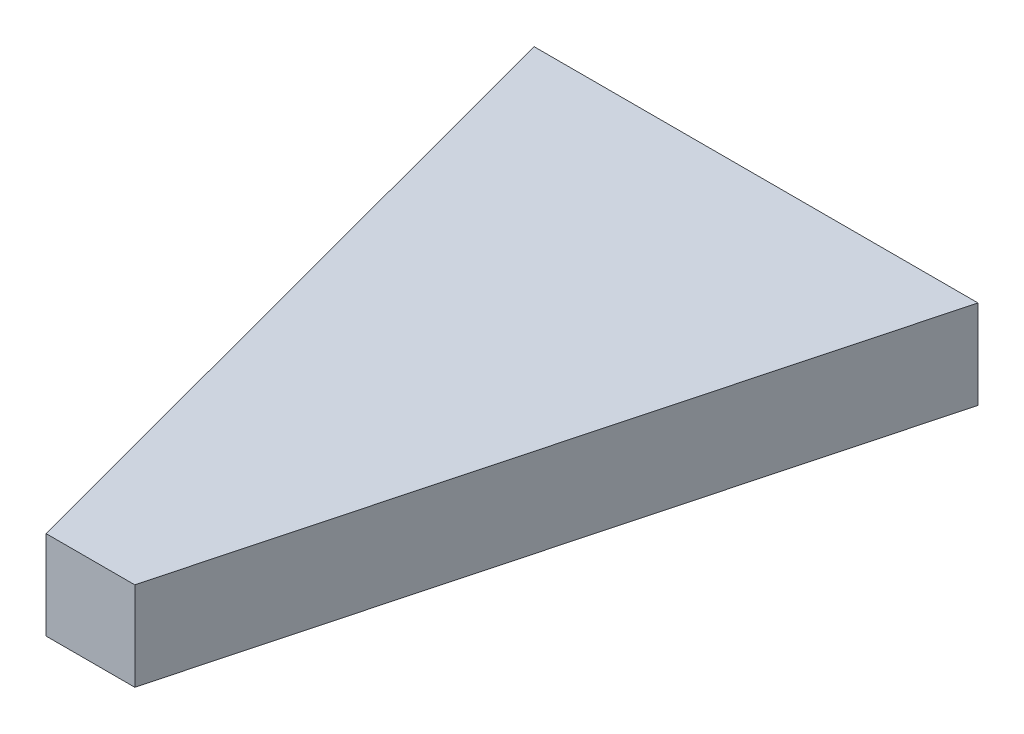
ISO-10303-21;
HEADER;
FILE_DESCRIPTION(('STEP AP214'),'2;1');
FILE_NAME('part.step','',(''),(''),'','','');
FILE_SCHEMA(('AUTOMOTIVE_DESIGN { 1 0 10303 214 1 1 1 1 }'));
ENDSEC;
DATA;
#1=APPLICATION_CONTEXT('core data for automotive mechanical design processes');
#2=APPLICATION_PROTOCOL_DEFINITION('international standard','automotive_design',2000,#1);
#3=PRODUCT_CONTEXT('',#1,'mechanical');
#4=PRODUCT('Part','Part','',(#3));
#5=PRODUCT_RELATED_PRODUCT_CATEGORY('part','',(#4));
#6=PRODUCT_DEFINITION_FORMATION('','',#4);
#7=PRODUCT_DEFINITION_CONTEXT('part definition',#1,'design');
#8=PRODUCT_DEFINITION('design','',#6,#7);
#9=PRODUCT_DEFINITION_SHAPE('','',#8);
#10=(LENGTH_UNIT() NAMED_UNIT(*) SI_UNIT(.MILLI.,.METRE.));
#11=(NAMED_UNIT(*) PLANE_ANGLE_UNIT() SI_UNIT($,.RADIAN.));
#12=(NAMED_UNIT(*) SI_UNIT($,.STERADIAN.) SOLID_ANGLE_UNIT());
#13=UNCERTAINTY_MEASURE_WITH_UNIT(LENGTH_MEASURE(1.E-05),#10,'distance_accuracy_value','');
#14=(GEOMETRIC_REPRESENTATION_CONTEXT(3) GLOBAL_UNCERTAINTY_ASSIGNED_CONTEXT((#13)) GLOBAL_UNIT_ASSIGNED_CONTEXT((#10,
#11,#12)) REPRESENTATION_CONTEXT('',''));
#15=CARTESIAN_POINT('',(0.,0.,0.));
#16=DIRECTION('',(0.,0.,1.));
#17=DIRECTION('',(1.,0.,0.));
#18=AXIS2_PLACEMENT_3D('',#15,#16,#17);
#19=CARTESIAN_POINT('',(-55.252382204068,8.,-24.0778265370164));
#20=DIRECTION('',(0.966234939601246,0.,-0.257662650560333));
#21=DIRECTION('',(-0.257662650560333,0.,-0.966234939601246));
#22=AXIS2_PLACEMENT_3D('',#19,#20,#21);
#23=PLANE('',#22);
#24=DIRECTION('',(0.257662650560333,0.,0.966234939601246));
#25=VECTOR('',#24,1.);
#26=CARTESIAN_POINT('',(-55.252382204068,0.,-24.0778265370164));
#27=LINE('',#26,#25);
#28=CARTESIAN_POINT('',(-55.252382204068,0.,-24.0778265370164));
#29=VERTEX_POINT('',#28);
#30=CARTESIAN_POINT('',(-39.2523822040679,0.,35.9221734629836));
#31=VERTEX_POINT('',#30);
#32=EDGE_CURVE('E99',#29,#31,#27,.T.);
#33=ORIENTED_EDGE('',*,*,#32,.T.);
#34=DIRECTION('',(0.,-1.,0.));
#35=VECTOR('',#34,1.);
#36=CARTESIAN_POINT('',(-39.2523822040679,8.,35.9221734629836));
#37=LINE('',#36,#35);
#38=CARTESIAN_POINT('',(-39.2523822040679,8.,35.9221734629836));
#39=VERTEX_POINT('',#38);
#40=EDGE_CURVE('E11',#39,#31,#37,.T.);
#41=ORIENTED_EDGE('',*,*,#40,.F.);
#42=DIRECTION('',(0.257662650560333,0.,0.966234939601246));
#43=VECTOR('',#42,1.);
#44=CARTESIAN_POINT('',(-55.252382204068,8.,-24.0778265370164));
#45=LINE('',#44,#43);
#46=CARTESIAN_POINT('',(-55.252382204068,8.,-24.0778265370164));
#47=VERTEX_POINT('',#46);
#48=EDGE_CURVE('E87',#47,#39,#45,.T.);
#49=ORIENTED_EDGE('',*,*,#48,.F.);
#50=DIRECTION('',(0.,-1.,0.));
#51=VECTOR('',#50,1.);
#52=CARTESIAN_POINT('',(-55.252382204068,8.,-24.0778265370164));
#53=LINE('',#52,#51);
#54=EDGE_CURVE('E95',#47,#29,#53,.T.);
#55=ORIENTED_EDGE('',*,*,#54,.T.);
#56=EDGE_LOOP('',(#33,#41,#49,#55));
#57=FACE_BOUND('',#56,.T.);
#58=ADVANCED_FACE('F36',(#57),#23,.F.);
#59=CARTESIAN_POINT('',(-39.2523822040679,8.,35.9221734629836));
#60=DIRECTION('',(0.,0.,-1.));
#61=DIRECTION('',(-1.,0.,0.));
#62=AXIS2_PLACEMENT_3D('',#59,#60,#61);
#63=PLANE('',#62);
#64=DIRECTION('',(1.,0.,0.));
#65=VECTOR('',#64,1.);
#66=CARTESIAN_POINT('',(-39.2523822040679,0.,35.9221734629836));
#67=LINE('',#66,#65);
#68=CARTESIAN_POINT('',(-31.2523822040679,0.,35.9221734629836));
#69=VERTEX_POINT('',#68);
#70=EDGE_CURVE('E91',#31,#69,#67,.T.);
#71=ORIENTED_EDGE('',*,*,#70,.T.);
#72=DIRECTION('',(0.,-1.,0.));
#73=VECTOR('',#72,1.);
#74=CARTESIAN_POINT('',(-31.2523822040679,8.,35.9221734629836));
#75=LINE('',#74,#73);
#76=CARTESIAN_POINT('',(-31.2523822040679,8.,35.9221734629836));
#77=VERTEX_POINT('',#76);
#78=EDGE_CURVE('E44',#77,#69,#75,.T.);
#79=ORIENTED_EDGE('',*,*,#78,.F.);
#80=DIRECTION('',(1.,0.,0.));
#81=VECTOR('',#80,1.);
#82=CARTESIAN_POINT('',(-39.2523822040679,8.,35.9221734629836));
#83=LINE('',#82,#81);
#84=EDGE_CURVE('E82',#39,#77,#83,.T.);
#85=ORIENTED_EDGE('',*,*,#84,.F.);
#86=ORIENTED_EDGE('',*,*,#40,.T.);
#87=EDGE_LOOP('',(#71,#79,#85,#86));
#88=FACE_BOUND('',#87,.T.);
#89=ADVANCED_FACE('F90',(#88),#63,.F.);
#90=CARTESIAN_POINT('',(-15.252382204068,8.,-24.0778265370164));
#91=DIRECTION('',(-0.966234939601246,0.,-0.257662650560332));
#92=DIRECTION('',(-0.257662650560332,0.,0.966234939601246));
#93=AXIS2_PLACEMENT_3D('',#90,#91,#92);
#94=PLANE('',#93);
#95=DIRECTION('',(0.257662650560332,0.,-0.966234939601247));
#96=VECTOR('',#95,1.);
#97=CARTESIAN_POINT('',(-15.252382204068,0.,-24.0778265370164));
#98=LINE('',#97,#96);
#99=CARTESIAN_POINT('',(-15.252382204068,0.,-24.0778265370164));
#100=VERTEX_POINT('',#99);
#101=EDGE_CURVE('E69',#69,#100,#98,.T.);
#102=ORIENTED_EDGE('',*,*,#101,.T.);
#103=DIRECTION('',(0.,-1.,0.));
#104=VECTOR('',#103,1.);
#105=CARTESIAN_POINT('',(-15.252382204068,8.,-24.0778265370164));
#106=LINE('',#105,#104);
#107=CARTESIAN_POINT('',(-15.252382204068,8.,-24.0778265370164));
#108=VERTEX_POINT('',#107);
#109=EDGE_CURVE('E92',#108,#100,#106,.T.);
#110=ORIENTED_EDGE('',*,*,#109,.F.);
#111=DIRECTION('',(0.257662650560332,0.,-0.966234939601247));
#112=VECTOR('',#111,1.);
#113=CARTESIAN_POINT('',(-15.252382204068,8.,-24.0778265370164));
#114=LINE('',#113,#112);
#115=EDGE_CURVE('E85',#77,#108,#114,.T.);
#116=ORIENTED_EDGE('',*,*,#115,.F.);
#117=ORIENTED_EDGE('',*,*,#78,.T.);
#118=EDGE_LOOP('',(#102,#110,#116,#117));
#119=FACE_BOUND('',#118,.T.);
#120=ADVANCED_FACE('F93',(#119),#94,.F.);
#121=CARTESIAN_POINT('',(-55.252382204068,8.,-24.0778265370164));
#122=DIRECTION('',(0.,0.,1.));
#123=DIRECTION('',(1.,0.,0.));
#124=AXIS2_PLACEMENT_3D('',#121,#122,#123);
#125=PLANE('',#124);
#126=DIRECTION('',(-1.,0.,0.));
#127=VECTOR('',#126,1.);
#128=CARTESIAN_POINT('',(-55.252382204068,0.,-24.0778265370164));
#129=LINE('',#128,#127);
#130=EDGE_CURVE('E75',#100,#29,#129,.T.);
#131=ORIENTED_EDGE('',*,*,#130,.T.);
#132=ORIENTED_EDGE('',*,*,#54,.F.);
#133=DIRECTION('',(-1.,0.,0.));
#134=VECTOR('',#133,1.);
#135=CARTESIAN_POINT('',(-55.252382204068,8.,-24.0778265370164));
#136=LINE('',#135,#134);
#137=EDGE_CURVE('E52',#108,#47,#136,.T.);
#138=ORIENTED_EDGE('',*,*,#137,.F.);
#139=ORIENTED_EDGE('',*,*,#109,.T.);
#140=EDGE_LOOP('',(#131,#132,#138,#139));
#141=FACE_BOUND('',#140,.T.);
#142=ADVANCED_FACE('F106',(#141),#125,.F.);
#143=CARTESIAN_POINT('',(0.,8.,0.));
#144=DIRECTION('',(0.,1.,0.));
#145=DIRECTION('',(0.,0.,1.));
#146=AXIS2_PLACEMENT_3D('',#143,#144,#145);
#147=PLANE('',#146);
#148=ORIENTED_EDGE('',*,*,#48,.T.);
#149=ORIENTED_EDGE('',*,*,#84,.T.);
#150=ORIENTED_EDGE('',*,*,#115,.T.);
#151=ORIENTED_EDGE('',*,*,#137,.T.);
#152=EDGE_LOOP('',(#148,#149,#150,#151));
#153=FACE_BOUND('',#152,.T.);
#154=ADVANCED_FACE('F83',(#153),#147,.T.);
#155=CARTESIAN_POINT('',(0.,0.,0.));
#156=DIRECTION('',(0.,1.,0.));
#157=DIRECTION('',(0.,0.,1.));
#158=AXIS2_PLACEMENT_3D('',#155,#156,#157);
#159=PLANE('',#158);
#160=ORIENTED_EDGE('',*,*,#32,.F.);
#161=ORIENTED_EDGE('',*,*,#130,.F.);
#162=ORIENTED_EDGE('',*,*,#101,.F.);
#163=ORIENTED_EDGE('',*,*,#70,.F.);
#164=EDGE_LOOP('',(#160,#161,#162,#163));
#165=FACE_BOUND('',#164,.T.);
#166=ADVANCED_FACE('F109',(#165),#159,.F.);
#167=CLOSED_SHELL('',(#58,#89,#120,#142,#154,#166));
#168=MANIFOLD_SOLID_BREP('B2',#167);
#169=ADVANCED_BREP_SHAPE_REPRESENTATION('',(#18,#168),#14);
#170=SHAPE_DEFINITION_REPRESENTATION(#9,#169);
ENDSEC;
END-ISO-10303-21;
